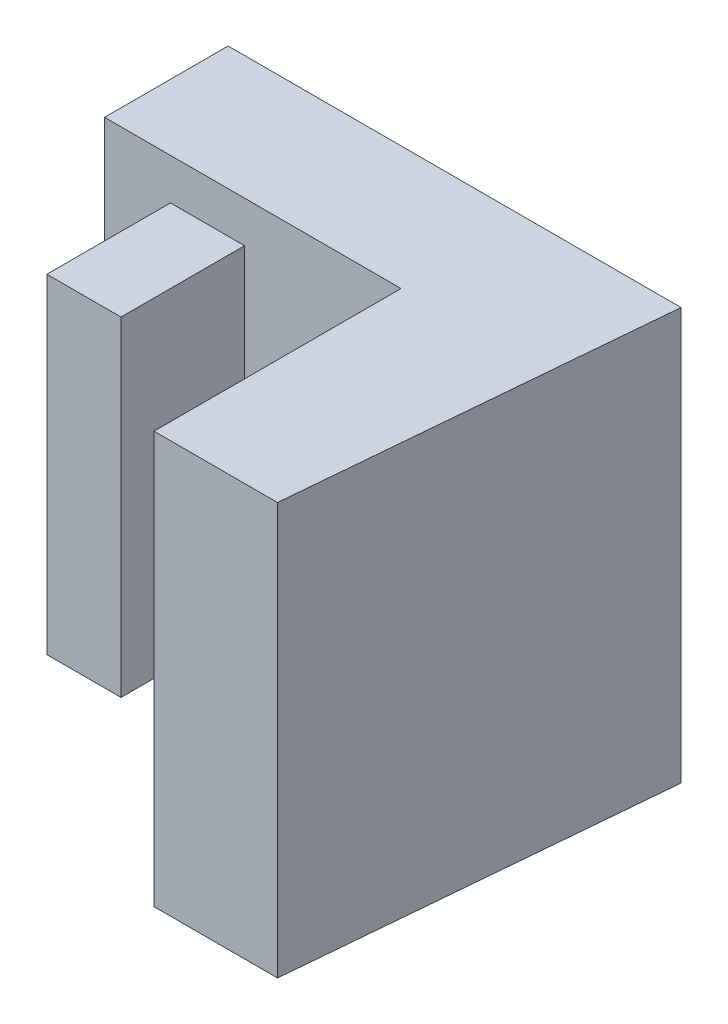
ISO-10303-21;
HEADER;
FILE_DESCRIPTION(('STEP AP214'),'2;1');
FILE_NAME('part.step','',(''),(''),'','','');
FILE_SCHEMA(('AUTOMOTIVE_DESIGN { 1 0 10303 214 1 1 1 1 }'));
ENDSEC;
DATA;
#1=APPLICATION_CONTEXT('core data for automotive mechanical design processes');
#2=APPLICATION_PROTOCOL_DEFINITION('international standard','automotive_design',2000,#1);
#3=PRODUCT_CONTEXT('',#1,'mechanical');
#4=PRODUCT('Part','Part','',(#3));
#5=PRODUCT_RELATED_PRODUCT_CATEGORY('part','',(#4));
#6=PRODUCT_DEFINITION_FORMATION('','',#4);
#7=PRODUCT_DEFINITION_CONTEXT('part definition',#1,'design');
#8=PRODUCT_DEFINITION('design','',#6,#7);
#9=PRODUCT_DEFINITION_SHAPE('','',#8);
#10=(LENGTH_UNIT() NAMED_UNIT(*) SI_UNIT(.MILLI.,.METRE.));
#11=(NAMED_UNIT(*) PLANE_ANGLE_UNIT() SI_UNIT($,.RADIAN.));
#12=(NAMED_UNIT(*) SI_UNIT($,.STERADIAN.) SOLID_ANGLE_UNIT());
#13=UNCERTAINTY_MEASURE_WITH_UNIT(LENGTH_MEASURE(1.E-05),#10,'distance_accuracy_value','');
#14=(GEOMETRIC_REPRESENTATION_CONTEXT(3) GLOBAL_UNCERTAINTY_ASSIGNED_CONTEXT((#13)) GLOBAL_UNIT_ASSIGNED_CONTEXT((#10,
#11,#12)) REPRESENTATION_CONTEXT('',''));
#15=CARTESIAN_POINT('',(0.,0.,0.));
#16=DIRECTION('',(0.,0.,1.));
#17=DIRECTION('',(1.,0.,0.));
#18=AXIS2_PLACEMENT_3D('',#15,#16,#17);
#19=CARTESIAN_POINT('',(0.,10.,0.));
#20=DIRECTION('',(0.,0.,-1.));
#21=DIRECTION('',(-1.,0.,0.));
#22=AXIS2_PLACEMENT_3D('',#19,#20,#21);
#23=PLANE('',#22);
#24=DIRECTION('',(1.,0.,0.));
#25=VECTOR('',#24,1.);
#26=CARTESIAN_POINT('',(0.,0.,0.));
#27=LINE('',#26,#25);
#28=CARTESIAN_POINT('',(0.,0.,0.));
#29=VERTEX_POINT('',#28);
#30=CARTESIAN_POINT('',(7.2,0.,0.));
#31=VERTEX_POINT('',#30);
#32=EDGE_CURVE('E134',#29,#31,#27,.T.);
#33=ORIENTED_EDGE('',*,*,#32,.T.);
#34=DIRECTION('',(0.,-1.,0.));
#35=VECTOR('',#34,1.);
#36=CARTESIAN_POINT('',(7.2,10.,0.));
#37=LINE('',#36,#35);
#38=CARTESIAN_POINT('',(7.2,10.,0.));
#39=VERTEX_POINT('',#38);
#40=EDGE_CURVE('E41',#39,#31,#37,.T.);
#41=ORIENTED_EDGE('',*,*,#40,.F.);
#42=DIRECTION('',(1.,0.,0.));
#43=VECTOR('',#42,1.);
#44=CARTESIAN_POINT('',(0.,10.,0.));
#45=LINE('',#44,#43);
#46=CARTESIAN_POINT('',(0.,10.,0.));
#47=VERTEX_POINT('',#46);
#48=EDGE_CURVE('E143',#47,#39,#45,.T.);
#49=ORIENTED_EDGE('',*,*,#48,.F.);
#50=DIRECTION('',(0.,-1.,0.));
#51=VECTOR('',#50,1.);
#52=CARTESIAN_POINT('',(0.,10.,0.));
#53=LINE('',#52,#51);
#54=EDGE_CURVE('E11',#47,#29,#53,.T.);
#55=ORIENTED_EDGE('',*,*,#54,.T.);
#56=EDGE_LOOP('',(#33,#41,#49,#55));
#57=FACE_BOUND('',#56,.T.);
#58=DIRECTION('',(0.,-1.,0.));
#59=VECTOR('',#58,1.);
#60=CARTESIAN_POINT('',(1.6,9.,0.));
#61=LINE('',#60,#59);
#62=CARTESIAN_POINT('',(1.6,9.,0.));
#63=VERTEX_POINT('',#62);
#64=CARTESIAN_POINT('',(1.6,0.999999999999999,0.));
#65=VERTEX_POINT('',#64);
#66=EDGE_CURVE('E130',#63,#65,#61,.T.);
#67=ORIENTED_EDGE('',*,*,#66,.F.);
#68=DIRECTION('',(-1.,0.,0.));
#69=VECTOR('',#68,1.);
#70=CARTESIAN_POINT('',(1.6,9.,0.));
#71=LINE('',#70,#69);
#72=CARTESIAN_POINT('',(3.4,9.,0.));
#73=VERTEX_POINT('',#72);
#74=EDGE_CURVE('E127',#73,#63,#71,.T.);
#75=ORIENTED_EDGE('',*,*,#74,.F.);
#76=DIRECTION('',(0.,1.,0.));
#77=VECTOR('',#76,1.);
#78=CARTESIAN_POINT('',(3.4,9.,0.));
#79=LINE('',#78,#77);
#80=CARTESIAN_POINT('',(3.4,0.999999999999999,0.));
#81=VERTEX_POINT('',#80);
#82=EDGE_CURVE('E53',#81,#73,#79,.T.);
#83=ORIENTED_EDGE('',*,*,#82,.F.);
#84=DIRECTION('',(1.,0.,0.));
#85=VECTOR('',#84,1.);
#86=CARTESIAN_POINT('',(1.6,1.,0.));
#87=LINE('',#86,#85);
#88=EDGE_CURVE('E48',#65,#81,#87,.T.);
#89=ORIENTED_EDGE('',*,*,#88,.F.);
#90=EDGE_LOOP('',(#67,#75,#83,#89));
#91=FACE_BOUND('',#90,.T.);
#92=ADVANCED_FACE('F33',(#57,#91),#23,.F.);
#93=CARTESIAN_POINT('',(0.,10.,-3.));
#94=DIRECTION('',(1.,0.,0.));
#95=DIRECTION('',(0.,0.,-1.));
#96=AXIS2_PLACEMENT_3D('',#93,#94,#95);
#97=PLANE('',#96);
#98=DIRECTION('',(0.,0.,1.));
#99=VECTOR('',#98,1.);
#100=CARTESIAN_POINT('',(0.,0.,-3.));
#101=LINE('',#100,#99);
#102=CARTESIAN_POINT('',(0.,0.,-3.));
#103=VERTEX_POINT('',#102);
#104=EDGE_CURVE('E131',#103,#29,#101,.T.);
#105=ORIENTED_EDGE('',*,*,#104,.T.);
#106=ORIENTED_EDGE('',*,*,#54,.F.);
#107=DIRECTION('',(0.,0.,1.));
#108=VECTOR('',#107,1.);
#109=CARTESIAN_POINT('',(0.,10.,-3.));
#110=LINE('',#109,#108);
#111=CARTESIAN_POINT('',(0.,10.,-3.));
#112=VERTEX_POINT('',#111);
#113=EDGE_CURVE('E140',#112,#47,#110,.T.);
#114=ORIENTED_EDGE('',*,*,#113,.F.);
#115=DIRECTION('',(0.,-1.,0.));
#116=VECTOR('',#115,1.);
#117=CARTESIAN_POINT('',(0.,10.,-3.));
#118=LINE('',#117,#116);
#119=EDGE_CURVE('E153',#112,#103,#118,.T.);
#120=ORIENTED_EDGE('',*,*,#119,.T.);
#121=EDGE_LOOP('',(#105,#106,#114,#120));
#122=FACE_BOUND('',#121,.T.);
#123=ADVANCED_FACE('F35',(#122),#97,.F.);
#124=CARTESIAN_POINT('',(7.2,10.,0.));
#125=DIRECTION('',(1.,0.,0.));
#126=DIRECTION('',(0.,0.,-1.));
#127=AXIS2_PLACEMENT_3D('',#124,#125,#126);
#128=PLANE('',#127);
#129=DIRECTION('',(0.,0.,1.));
#130=VECTOR('',#129,1.);
#131=CARTESIAN_POINT('',(7.2,0.,0.));
#132=LINE('',#131,#130);
#133=CARTESIAN_POINT('',(7.2,0.,6.));
#134=VERTEX_POINT('',#133);
#135=EDGE_CURVE('E156',#31,#134,#132,.T.);
#136=ORIENTED_EDGE('',*,*,#135,.T.);
#137=DIRECTION('',(0.,-1.,0.));
#138=VECTOR('',#137,1.);
#139=CARTESIAN_POINT('',(7.2,10.,6.));
#140=LINE('',#139,#138);
#141=CARTESIAN_POINT('',(7.2,10.,6.));
#142=VERTEX_POINT('',#141);
#143=EDGE_CURVE('E171',#142,#134,#140,.T.);
#144=ORIENTED_EDGE('',*,*,#143,.F.);
#145=DIRECTION('',(0.,0.,1.));
#146=VECTOR('',#145,1.);
#147=CARTESIAN_POINT('',(7.2,10.,0.));
#148=LINE('',#147,#146);
#149=EDGE_CURVE('E146',#39,#142,#148,.T.);
#150=ORIENTED_EDGE('',*,*,#149,.F.);
#151=ORIENTED_EDGE('',*,*,#40,.T.);
#152=EDGE_LOOP('',(#136,#144,#150,#151));
#153=FACE_BOUND('',#152,.T.);
#154=ADVANCED_FACE('F178',(#153),#128,.F.);
#155=CARTESIAN_POINT('',(7.2,10.,6.));
#156=DIRECTION('',(0.,0.,-1.));
#157=DIRECTION('',(-1.,0.,0.));
#158=AXIS2_PLACEMENT_3D('',#155,#156,#157);
#159=PLANE('',#158);
#160=DIRECTION('',(1.,0.,0.));
#161=VECTOR('',#160,1.);
#162=CARTESIAN_POINT('',(7.2,0.,6.));
#163=LINE('',#162,#161);
#164=CARTESIAN_POINT('',(10.2,0.,6.));
#165=VERTEX_POINT('',#164);
#166=EDGE_CURVE('E158',#134,#165,#163,.T.);
#167=ORIENTED_EDGE('',*,*,#166,.T.);
#168=DIRECTION('',(0.,-1.,0.));
#169=VECTOR('',#168,1.);
#170=CARTESIAN_POINT('',(10.2,10.,6.));
#171=LINE('',#170,#169);
#172=CARTESIAN_POINT('',(10.2,10.,6.));
#173=VERTEX_POINT('',#172);
#174=EDGE_CURVE('E168',#173,#165,#171,.T.);
#175=ORIENTED_EDGE('',*,*,#174,.F.);
#176=DIRECTION('',(1.,0.,0.));
#177=VECTOR('',#176,1.);
#178=CARTESIAN_POINT('',(7.2,10.,6.));
#179=LINE('',#178,#177);
#180=EDGE_CURVE('E148',#142,#173,#179,.T.);
#181=ORIENTED_EDGE('',*,*,#180,.F.);
#182=ORIENTED_EDGE('',*,*,#143,.T.);
#183=EDGE_LOOP('',(#167,#175,#181,#182));
#184=FACE_BOUND('',#183,.T.);
#185=ADVANCED_FACE('F189',(#184),#159,.F.);
#186=CARTESIAN_POINT('',(10.2,10.,6.));
#187=DIRECTION('',(-0.996072640692687,0.,-0.0885397902837942));
#188=DIRECTION('',(-0.0885397902837942,0.,0.996072640692687));
#189=AXIS2_PLACEMENT_3D('',#186,#187,#188);
#190=PLANE('',#189);
#191=DIRECTION('',(0.0885397902837942,0.,-0.996072640692687));
#192=VECTOR('',#191,1.);
#193=CARTESIAN_POINT('',(10.2,0.,6.));
#194=LINE('',#193,#192);
#195=CARTESIAN_POINT('',(11.,0.,-3.));
#196=VERTEX_POINT('',#195);
#197=EDGE_CURVE('E160',#165,#196,#194,.T.);
#198=ORIENTED_EDGE('',*,*,#197,.T.);
#199=DIRECTION('',(0.,-1.,0.));
#200=VECTOR('',#199,1.);
#201=CARTESIAN_POINT('',(11.,10.,-3.));
#202=LINE('',#201,#200);
#203=CARTESIAN_POINT('',(11.,10.,-3.));
#204=VERTEX_POINT('',#203);
#205=EDGE_CURVE('E165',#204,#196,#202,.T.);
#206=ORIENTED_EDGE('',*,*,#205,.F.);
#207=DIRECTION('',(0.0885397902837942,0.,-0.996072640692687));
#208=VECTOR('',#207,1.);
#209=CARTESIAN_POINT('',(10.2,10.,6.));
#210=LINE('',#209,#208);
#211=EDGE_CURVE('E150',#173,#204,#210,.T.);
#212=ORIENTED_EDGE('',*,*,#211,.F.);
#213=ORIENTED_EDGE('',*,*,#174,.T.);
#214=EDGE_LOOP('',(#198,#206,#212,#213));
#215=FACE_BOUND('',#214,.T.);
#216=ADVANCED_FACE('F193',(#215),#190,.F.);
#217=CARTESIAN_POINT('',(11.,10.,-3.));
#218=DIRECTION('',(0.,0.,1.));
#219=DIRECTION('',(1.,0.,0.));
#220=AXIS2_PLACEMENT_3D('',#217,#218,#219);
#221=PLANE('',#220);
#222=DIRECTION('',(-1.,0.,0.));
#223=VECTOR('',#222,1.);
#224=CARTESIAN_POINT('',(11.,0.,-3.));
#225=LINE('',#224,#223);
#226=EDGE_CURVE('E144',#196,#103,#225,.T.);
#227=ORIENTED_EDGE('',*,*,#226,.T.);
#228=ORIENTED_EDGE('',*,*,#119,.F.);
#229=DIRECTION('',(-1.,0.,0.));
#230=VECTOR('',#229,1.);
#231=CARTESIAN_POINT('',(11.,10.,-3.));
#232=LINE('',#231,#230);
#233=EDGE_CURVE('E152',#204,#112,#232,.T.);
#234=ORIENTED_EDGE('',*,*,#233,.F.);
#235=ORIENTED_EDGE('',*,*,#205,.T.);
#236=EDGE_LOOP('',(#227,#228,#234,#235));
#237=FACE_BOUND('',#236,.T.);
#238=ADVANCED_FACE('F203',(#237),#221,.F.);
#239=CARTESIAN_POINT('',(0.,10.,0.));
#240=DIRECTION('',(0.,1.,0.));
#241=DIRECTION('',(0.,0.,1.));
#242=AXIS2_PLACEMENT_3D('',#239,#240,#241);
#243=PLANE('',#242);
#244=ORIENTED_EDGE('',*,*,#113,.T.);
#245=ORIENTED_EDGE('',*,*,#48,.T.);
#246=ORIENTED_EDGE('',*,*,#149,.T.);
#247=ORIENTED_EDGE('',*,*,#180,.T.);
#248=ORIENTED_EDGE('',*,*,#211,.T.);
#249=ORIENTED_EDGE('',*,*,#233,.T.);
#250=EDGE_LOOP('',(#244,#245,#246,#247,#248,#249));
#251=FACE_BOUND('',#250,.T.);
#252=ADVANCED_FACE('F197',(#251),#243,.T.);
#253=CARTESIAN_POINT('',(0.,0.,0.));
#254=DIRECTION('',(0.,1.,0.));
#255=DIRECTION('',(0.,0.,1.));
#256=AXIS2_PLACEMENT_3D('',#253,#254,#255);
#257=PLANE('',#256);
#258=ORIENTED_EDGE('',*,*,#104,.F.);
#259=ORIENTED_EDGE('',*,*,#226,.F.);
#260=ORIENTED_EDGE('',*,*,#197,.F.);
#261=ORIENTED_EDGE('',*,*,#166,.F.);
#262=ORIENTED_EDGE('',*,*,#135,.F.);
#263=ORIENTED_EDGE('',*,*,#32,.F.);
#264=EDGE_LOOP('',(#258,#259,#260,#261,#262,#263));
#265=FACE_BOUND('',#264,.T.);
#266=ADVANCED_FACE('F184',(#265),#257,.F.);
#267=CARTESIAN_POINT('',(1.6,9.,3.));
#268=DIRECTION('',(1.,0.,0.));
#269=DIRECTION('',(0.,1.,0.));
#270=AXIS2_PLACEMENT_3D('',#267,#268,#269);
#271=PLANE('',#270);
#272=ORIENTED_EDGE('',*,*,#66,.T.);
#273=DIRECTION('',(0.,0.,-1.));
#274=VECTOR('',#273,1.);
#275=CARTESIAN_POINT('',(1.6,1.,3.));
#276=LINE('',#275,#274);
#277=CARTESIAN_POINT('',(1.6,1.,3.));
#278=VERTEX_POINT('',#277);
#279=EDGE_CURVE('E111',#278,#65,#276,.T.);
#280=ORIENTED_EDGE('',*,*,#279,.F.);
#281=DIRECTION('',(0.,-1.,0.));
#282=VECTOR('',#281,1.);
#283=CARTESIAN_POINT('',(1.6,9.,3.));
#284=LINE('',#283,#282);
#285=CARTESIAN_POINT('',(1.6,9.,3.));
#286=VERTEX_POINT('',#285);
#287=EDGE_CURVE('E118',#286,#278,#284,.T.);
#288=ORIENTED_EDGE('',*,*,#287,.F.);
#289=DIRECTION('',(0.,0.,-1.));
#290=VECTOR('',#289,1.);
#291=CARTESIAN_POINT('',(1.6,9.,3.));
#292=LINE('',#291,#290);
#293=EDGE_CURVE('E300',#286,#63,#292,.T.);
#294=ORIENTED_EDGE('',*,*,#293,.T.);
#295=EDGE_LOOP('',(#272,#280,#288,#294));
#296=FACE_BOUND('',#295,.T.);
#297=ADVANCED_FACE('F129',(#296),#271,.F.);
#298=CARTESIAN_POINT('',(1.6,1.,3.));
#299=DIRECTION('',(0.,1.,0.));
#300=DIRECTION('',(0.,0.,1.));
#301=AXIS2_PLACEMENT_3D('',#298,#299,#300);
#302=PLANE('',#301);
#303=ORIENTED_EDGE('',*,*,#88,.T.);
#304=DIRECTION('',(0.,0.,-1.));
#305=VECTOR('',#304,1.);
#306=CARTESIAN_POINT('',(3.4,1.,3.));
#307=LINE('',#306,#305);
#308=CARTESIAN_POINT('',(3.4,1.,3.));
#309=VERTEX_POINT('',#308);
#310=EDGE_CURVE('E114',#309,#81,#307,.T.);
#311=ORIENTED_EDGE('',*,*,#310,.F.);
#312=DIRECTION('',(1.,0.,0.));
#313=VECTOR('',#312,1.);
#314=CARTESIAN_POINT('',(1.6,1.,3.));
#315=LINE('',#314,#313);
#316=EDGE_CURVE('E107',#278,#309,#315,.T.);
#317=ORIENTED_EDGE('',*,*,#316,.F.);
#318=ORIENTED_EDGE('',*,*,#279,.T.);
#319=EDGE_LOOP('',(#303,#311,#317,#318));
#320=FACE_BOUND('',#319,.T.);
#321=ADVANCED_FACE('F109',(#320),#302,.F.);
#322=CARTESIAN_POINT('',(3.4,9.,3.));
#323=DIRECTION('',(-1.,0.,0.));
#324=DIRECTION('',(0.,-1.,0.));
#325=AXIS2_PLACEMENT_3D('',#322,#323,#324);
#326=PLANE('',#325);
#327=ORIENTED_EDGE('',*,*,#82,.T.);
#328=DIRECTION('',(0.,0.,-1.));
#329=VECTOR('',#328,1.);
#330=CARTESIAN_POINT('',(3.4,9.,3.));
#331=LINE('',#330,#329);
#332=CARTESIAN_POINT('',(3.4,9.,3.));
#333=VERTEX_POINT('',#332);
#334=EDGE_CURVE('E136',#333,#73,#331,.T.);
#335=ORIENTED_EDGE('',*,*,#334,.F.);
#336=DIRECTION('',(0.,1.,0.));
#337=VECTOR('',#336,1.);
#338=CARTESIAN_POINT('',(3.4,9.,3.));
#339=LINE('',#338,#337);
#340=EDGE_CURVE('E117',#309,#333,#339,.T.);
#341=ORIENTED_EDGE('',*,*,#340,.F.);
#342=ORIENTED_EDGE('',*,*,#310,.T.);
#343=EDGE_LOOP('',(#327,#335,#341,#342));
#344=FACE_BOUND('',#343,.T.);
#345=ADVANCED_FACE('F267',(#344),#326,.F.);
#346=CARTESIAN_POINT('',(1.6,9.,3.));
#347=DIRECTION('',(0.,-1.,0.));
#348=DIRECTION('',(0.,0.,-1.));
#349=AXIS2_PLACEMENT_3D('',#346,#347,#348);
#350=PLANE('',#349);
#351=ORIENTED_EDGE('',*,*,#74,.T.);
#352=ORIENTED_EDGE('',*,*,#293,.F.);
#353=DIRECTION('',(-1.,0.,0.));
#354=VECTOR('',#353,1.);
#355=CARTESIAN_POINT('',(1.6,9.,3.));
#356=LINE('',#355,#354);
#357=EDGE_CURVE('E123',#333,#286,#356,.T.);
#358=ORIENTED_EDGE('',*,*,#357,.F.);
#359=ORIENTED_EDGE('',*,*,#334,.T.);
#360=EDGE_LOOP('',(#351,#352,#358,#359));
#361=FACE_BOUND('',#360,.T.);
#362=ADVANCED_FACE('F276',(#361),#350,.F.);
#363=CARTESIAN_POINT('',(0.,0.,3.));
#364=DIRECTION('',(0.,0.,1.));
#365=DIRECTION('',(1.,0.,0.));
#366=AXIS2_PLACEMENT_3D('',#363,#364,#365);
#367=PLANE('',#366);
#368=ORIENTED_EDGE('',*,*,#287,.T.);
#369=ORIENTED_EDGE('',*,*,#316,.T.);
#370=ORIENTED_EDGE('',*,*,#340,.T.);
#371=ORIENTED_EDGE('',*,*,#357,.T.);
#372=EDGE_LOOP('',(#368,#369,#370,#371));
#373=FACE_BOUND('',#372,.T.);
#374=ADVANCED_FACE('F121',(#373),#367,.T.);
#375=CLOSED_SHELL('',(#92,#123,#154,#185,#216,#238,#252,#266,#297,#321,#345,#362,#374));
#376=MANIFOLD_SOLID_BREP('B2',#375);
#377=ADVANCED_BREP_SHAPE_REPRESENTATION('',(#18,#376),#14);
#378=SHAPE_DEFINITION_REPRESENTATION(#9,#377);
ENDSEC;
END-ISO-10303-21;
